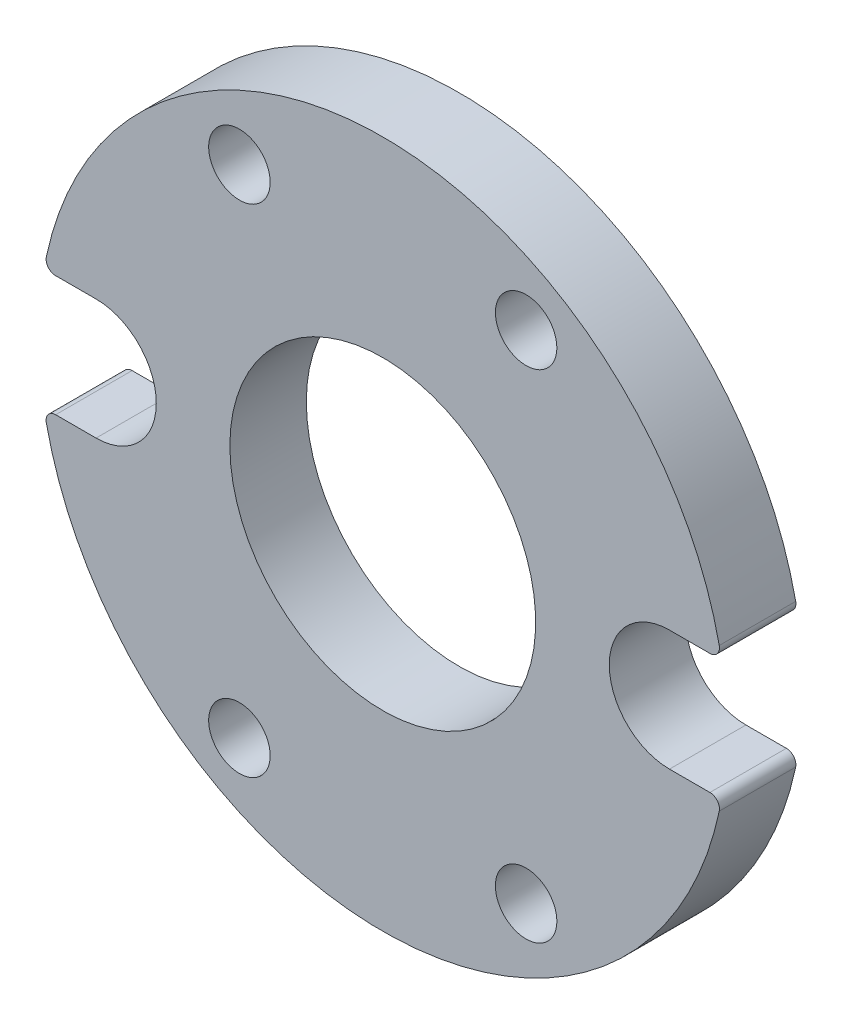
ISO-10303-21;
HEADER;
FILE_DESCRIPTION(('STEP AP214'),'2;1');
FILE_NAME('part.step','',(''),(''),'','','');
FILE_SCHEMA(('AUTOMOTIVE_DESIGN { 1 0 10303 214 1 1 1 1 }'));
ENDSEC;
DATA;
#1=APPLICATION_CONTEXT('core data for automotive mechanical design processes');
#2=APPLICATION_PROTOCOL_DEFINITION('international standard','automotive_design',2000,#1);
#3=PRODUCT_CONTEXT('',#1,'mechanical');
#4=PRODUCT('Part','Part','',(#3));
#5=PRODUCT_RELATED_PRODUCT_CATEGORY('part','',(#4));
#6=PRODUCT_DEFINITION_FORMATION('','',#4);
#7=PRODUCT_DEFINITION_CONTEXT('part definition',#1,'design');
#8=PRODUCT_DEFINITION('design','',#6,#7);
#9=PRODUCT_DEFINITION_SHAPE('','',#8);
#10=(LENGTH_UNIT() NAMED_UNIT(*) SI_UNIT(.MILLI.,.METRE.));
#11=(NAMED_UNIT(*) PLANE_ANGLE_UNIT() SI_UNIT($,.RADIAN.));
#12=(NAMED_UNIT(*) SI_UNIT($,.STERADIAN.) SOLID_ANGLE_UNIT());
#13=UNCERTAINTY_MEASURE_WITH_UNIT(LENGTH_MEASURE(1.E-05),#10,'distance_accuracy_value','');
#14=(GEOMETRIC_REPRESENTATION_CONTEXT(3) GLOBAL_UNCERTAINTY_ASSIGNED_CONTEXT((#13)) GLOBAL_UNIT_ASSIGNED_CONTEXT((#10,
#11,#12)) REPRESENTATION_CONTEXT('',''));
#15=CARTESIAN_POINT('',(0.,0.,0.));
#16=DIRECTION('',(0.,0.,1.));
#17=DIRECTION('',(1.,0.,0.));
#18=AXIS2_PLACEMENT_3D('',#15,#16,#17);
#19=CARTESIAN_POINT('',(27.1703940438853,5.79375,3.175));
#20=DIRECTION('',(0.,0.,-1.));
#21=DIRECTION('',(-1.,0.,0.));
#22=AXIS2_PLACEMENT_3D('',#19,#20,#21);
#23=CYLINDRICAL_SURFACE('',#22,0.793749999999999);
#24=CARTESIAN_POINT('',(27.1703940438853,5.79375,3.175));
#25=DIRECTION('',(0.,0.,-1.));
#26=DIRECTION('',(-1.,0.,0.));
#27=AXIS2_PLACEMENT_3D('',#24,#25,#26);
#28=CIRCLE('',#27,0.793749999999999);
#29=CARTESIAN_POINT('',(27.1703940438853,5.,3.175));
#30=VERTEX_POINT('',#29);
#31=CARTESIAN_POINT('',(27.9466910165678,5.95928571428572,3.175));
#32=VERTEX_POINT('',#31);
#33=EDGE_CURVE('E95',#30,#32,#28,.F.);
#34=ORIENTED_EDGE('',*,*,#33,.F.);
#35=DIRECTION('',(0.,0.,-1.));
#36=VECTOR('',#35,1.);
#37=CARTESIAN_POINT('',(27.1703940438853,5.,-3.175));
#38=LINE('',#37,#36);
#39=CARTESIAN_POINT('',(27.1703940438853,5.,-3.175));
#40=VERTEX_POINT('',#39);
#41=EDGE_CURVE('E149',#40,#30,#38,.F.);
#42=ORIENTED_EDGE('',*,*,#41,.F.);
#43=CARTESIAN_POINT('',(27.1703940438853,5.79375,-3.175));
#44=DIRECTION('',(0.,0.,-1.));
#45=DIRECTION('',(-1.,0.,0.));
#46=AXIS2_PLACEMENT_3D('',#43,#44,#45);
#47=CIRCLE('',#46,0.793749999999999);
#48=CARTESIAN_POINT('',(27.9466910165678,5.95928571428572,-3.175));
#49=VERTEX_POINT('',#48);
#50=EDGE_CURVE('E19',#40,#49,#47,.F.);
#51=ORIENTED_EDGE('',*,*,#50,.T.);
#52=DIRECTION('',(0.,0.,-1.));
#53=VECTOR('',#52,1.);
#54=CARTESIAN_POINT('',(27.9466910165678,5.95928571428572,3.175));
#55=LINE('',#54,#53);
#56=EDGE_CURVE('E107',#32,#49,#55,.T.);
#57=ORIENTED_EDGE('',*,*,#56,.F.);
#58=EDGE_LOOP('',(#34,#42,#51,#57));
#59=FACE_BOUND('',#58,.T.);
#60=ADVANCED_FACE('F16',(#59),#23,.T.);
#61=CARTESIAN_POINT('',(-27.1703940438853,5.79375,3.175));
#62=DIRECTION('',(0.,0.,-1.));
#63=DIRECTION('',(-1.,0.,0.));
#64=AXIS2_PLACEMENT_3D('',#61,#62,#63);
#65=CYLINDRICAL_SURFACE('',#64,0.793749999999999);
#66=CARTESIAN_POINT('',(-27.1703940438853,5.79375,-3.175));
#67=DIRECTION('',(0.,0.,-1.));
#68=DIRECTION('',(-1.,0.,0.));
#69=AXIS2_PLACEMENT_3D('',#66,#67,#68);
#70=CIRCLE('',#69,0.793749999999999);
#71=CARTESIAN_POINT('',(-27.9466910165678,5.95928571428572,-3.175));
#72=VERTEX_POINT('',#71);
#73=CARTESIAN_POINT('',(-27.1703940438853,5.,-3.175));
#74=VERTEX_POINT('',#73);
#75=EDGE_CURVE('E83',#72,#74,#70,.F.);
#76=ORIENTED_EDGE('',*,*,#75,.T.);
#77=DIRECTION('',(0.,0.,1.));
#78=VECTOR('',#77,1.);
#79=CARTESIAN_POINT('',(-27.1703940438853,5.,-3.175));
#80=LINE('',#79,#78);
#81=CARTESIAN_POINT('',(-27.1703940438853,5.,3.175));
#82=VERTEX_POINT('',#81);
#83=EDGE_CURVE('E185',#74,#82,#80,.T.);
#84=ORIENTED_EDGE('',*,*,#83,.T.);
#85=CARTESIAN_POINT('',(-27.1703940438853,5.79375,3.175));
#86=DIRECTION('',(0.,0.,-1.));
#87=DIRECTION('',(-1.,0.,0.));
#88=AXIS2_PLACEMENT_3D('',#85,#86,#87);
#89=CIRCLE('',#88,0.793749999999999);
#90=CARTESIAN_POINT('',(-27.9466910165678,5.95928571428572,3.175));
#91=VERTEX_POINT('',#90);
#92=EDGE_CURVE('E99',#91,#82,#89,.F.);
#93=ORIENTED_EDGE('',*,*,#92,.F.);
#94=DIRECTION('',(0.,0.,-1.));
#95=VECTOR('',#94,1.);
#96=CARTESIAN_POINT('',(-27.9466910165678,5.95928571428572,3.175));
#97=LINE('',#96,#95);
#98=EDGE_CURVE('E97',#72,#91,#97,.F.);
#99=ORIENTED_EDGE('',*,*,#98,.F.);
#100=EDGE_LOOP('',(#76,#84,#93,#99));
#101=FACE_BOUND('',#100,.T.);
#102=ADVANCED_FACE('F98',(#101),#65,.T.);
#103=CARTESIAN_POINT('',(0.,0.,3.175));
#104=DIRECTION('',(0.,0.,1.));
#105=DIRECTION('',(1.,0.,0.));
#106=AXIS2_PLACEMENT_3D('',#103,#104,#105);
#107=PLANE('',#106);
#108=DIRECTION('',(-1.,0.,0.));
#109=VECTOR('',#108,1.);
#110=CARTESIAN_POINT('',(0.,4.99999999999999,3.175));
#111=LINE('',#110,#109);
#112=CARTESIAN_POINT('',(-23.8125,5.,3.175));
#113=VERTEX_POINT('',#112);
#114=EDGE_CURVE('E187',#82,#113,#111,.F.);
#115=ORIENTED_EDGE('',*,*,#114,.T.);
#116=CARTESIAN_POINT('',(-23.8125,0.,3.175));
#117=DIRECTION('',(0.,0.,1.));
#118=DIRECTION('',(1.,0.,0.));
#119=AXIS2_PLACEMENT_3D('',#116,#117,#118);
#120=CIRCLE('',#119,5.);
#121=CARTESIAN_POINT('',(-23.8125,-5.,3.175));
#122=VERTEX_POINT('',#121);
#123=EDGE_CURVE('E140',#113,#122,#120,.F.);
#124=ORIENTED_EDGE('',*,*,#123,.T.);
#125=DIRECTION('',(-1.,0.,0.));
#126=VECTOR('',#125,1.);
#127=CARTESIAN_POINT('',(0.,-4.99999999999999,3.175));
#128=LINE('',#127,#126);
#129=CARTESIAN_POINT('',(-27.1703940438853,-5.,3.175));
#130=VERTEX_POINT('',#129);
#131=EDGE_CURVE('E199',#130,#122,#128,.F.);
#132=ORIENTED_EDGE('',*,*,#131,.F.);
#133=CARTESIAN_POINT('',(-27.1703940438853,-5.79375,3.175));
#134=DIRECTION('',(0.,0.,-1.));
#135=DIRECTION('',(-1.,0.,0.));
#136=AXIS2_PLACEMENT_3D('',#133,#134,#135);
#137=CIRCLE('',#136,0.793749999999999);
#138=CARTESIAN_POINT('',(-27.9466910165678,-5.95928571428571,3.175));
#139=VERTEX_POINT('',#138);
#140=EDGE_CURVE('E174',#139,#130,#137,.T.);
#141=ORIENTED_EDGE('',*,*,#140,.F.);
#142=CARTESIAN_POINT('',(0.,0.,3.175));
#143=DIRECTION('',(0.,0.,-1.));
#144=DIRECTION('',(-1.,0.,0.));
#145=AXIS2_PLACEMENT_3D('',#142,#143,#144);
#146=CIRCLE('',#145,28.575);
#147=CARTESIAN_POINT('',(27.9466910165678,-5.95928571428571,3.175));
#148=VERTEX_POINT('',#147);
#149=EDGE_CURVE('E136',#148,#139,#146,.T.);
#150=ORIENTED_EDGE('',*,*,#149,.F.);
#151=CARTESIAN_POINT('',(27.1703940438853,-5.79375,3.175));
#152=DIRECTION('',(0.,0.,-1.));
#153=DIRECTION('',(-1.,0.,0.));
#154=AXIS2_PLACEMENT_3D('',#151,#152,#153);
#155=CIRCLE('',#154,0.793749999999999);
#156=CARTESIAN_POINT('',(27.1703940438853,-5.,3.175));
#157=VERTEX_POINT('',#156);
#158=EDGE_CURVE('E167',#157,#148,#155,.T.);
#159=ORIENTED_EDGE('',*,*,#158,.F.);
#160=DIRECTION('',(1.,0.,0.));
#161=VECTOR('',#160,1.);
#162=CARTESIAN_POINT('',(0.,-5.,3.175));
#163=LINE('',#162,#161);
#164=CARTESIAN_POINT('',(23.8125,-5.,3.175));
#165=VERTEX_POINT('',#164);
#166=EDGE_CURVE('E196',#157,#165,#163,.F.);
#167=ORIENTED_EDGE('',*,*,#166,.T.);
#168=CARTESIAN_POINT('',(23.8125,0.,3.175));
#169=DIRECTION('',(0.,0.,1.));
#170=DIRECTION('',(1.,0.,0.));
#171=AXIS2_PLACEMENT_3D('',#168,#169,#170);
#172=CIRCLE('',#171,5.);
#173=CARTESIAN_POINT('',(23.8125,5.,3.175));
#174=VERTEX_POINT('',#173);
#175=EDGE_CURVE('E146',#165,#174,#172,.F.);
#176=ORIENTED_EDGE('',*,*,#175,.T.);
#177=DIRECTION('',(1.,0.,0.));
#178=VECTOR('',#177,1.);
#179=CARTESIAN_POINT('',(0.,5.,3.175));
#180=LINE('',#179,#178);
#181=EDGE_CURVE('E184',#30,#174,#180,.F.);
#182=ORIENTED_EDGE('',*,*,#181,.F.);
#183=ORIENTED_EDGE('',*,*,#33,.T.);
#184=CARTESIAN_POINT('',(0.,0.,3.175));
#185=DIRECTION('',(0.,0.,-1.));
#186=DIRECTION('',(-1.,0.,0.));
#187=AXIS2_PLACEMENT_3D('',#184,#185,#186);
#188=CIRCLE('',#187,28.575);
#189=EDGE_CURVE('E103',#91,#32,#188,.T.);
#190=ORIENTED_EDGE('',*,*,#189,.F.);
#191=ORIENTED_EDGE('',*,*,#92,.T.);
#192=EDGE_LOOP('',(#115,#124,#132,#141,#150,#159,#167,#176,#182,#183,#190,#191));
#193=FACE_BOUND('',#192,.T.);
#194=CARTESIAN_POINT('',(0.,0.,3.175));
#195=DIRECTION('',(0.,0.,-1.));
#196=DIRECTION('',(-1.,0.,0.));
#197=AXIS2_PLACEMENT_3D('',#194,#195,#196);
#198=CIRCLE('',#197,12.7);
#199=CARTESIAN_POINT('',(-12.7,0.,3.175));
#200=VERTEX_POINT('',#199);
#201=EDGE_CURVE('E151',#200,#200,#198,.T.);
#202=ORIENTED_EDGE('',*,*,#201,.T.);
#203=EDGE_LOOP('',(#202));
#204=FACE_BOUND('',#203,.T.);
#205=CARTESIAN_POINT('',(11.90625,20.622229927617,3.175));
#206=DIRECTION('',(0.,0.,1.));
#207=DIRECTION('',(1.,0.,0.));
#208=AXIS2_PLACEMENT_3D('',#205,#206,#207);
#209=CIRCLE('',#208,2.5527);
#210=CARTESIAN_POINT('',(14.45895,20.622229927617,3.175));
#211=VERTEX_POINT('',#210);
#212=EDGE_CURVE('E155',#211,#211,#209,.F.);
#213=ORIENTED_EDGE('',*,*,#212,.T.);
#214=EDGE_LOOP('',(#213));
#215=FACE_BOUND('',#214,.T.);
#216=CARTESIAN_POINT('',(-11.9062500000001,20.6222299276169,3.175));
#217=DIRECTION('',(0.,0.,1.));
#218=DIRECTION('',(1.,0.,0.));
#219=AXIS2_PLACEMENT_3D('',#216,#217,#218);
#220=CIRCLE('',#219,2.5527);
#221=CARTESIAN_POINT('',(-9.3535500000001,20.6222299276169,3.175));
#222=VERTEX_POINT('',#221);
#223=EDGE_CURVE('E158',#222,#222,#220,.F.);
#224=ORIENTED_EDGE('',*,*,#223,.T.);
#225=EDGE_LOOP('',(#224));
#226=FACE_BOUND('',#225,.T.);
#227=CARTESIAN_POINT('',(-11.9062499999998,-20.6222299276171,3.175));
#228=DIRECTION('',(0.,0.,1.));
#229=DIRECTION('',(1.,0.,0.));
#230=AXIS2_PLACEMENT_3D('',#227,#228,#229);
#231=CIRCLE('',#230,2.5527);
#232=CARTESIAN_POINT('',(-9.35354999999981,-20.6222299276171,3.175));
#233=VERTEX_POINT('',#232);
#234=EDGE_CURVE('E161',#233,#233,#231,.F.);
#235=ORIENTED_EDGE('',*,*,#234,.T.);
#236=EDGE_LOOP('',(#235));
#237=FACE_BOUND('',#236,.T.);
#238=CARTESIAN_POINT('',(11.9062500000002,-20.6222299276168,3.175));
#239=DIRECTION('',(0.,0.,1.));
#240=DIRECTION('',(1.,0.,0.));
#241=AXIS2_PLACEMENT_3D('',#238,#239,#240);
#242=CIRCLE('',#241,2.5527);
#243=CARTESIAN_POINT('',(14.4589500000002,-20.6222299276168,3.175));
#244=VERTEX_POINT('',#243);
#245=EDGE_CURVE('E164',#244,#244,#242,.F.);
#246=ORIENTED_EDGE('',*,*,#245,.T.);
#247=EDGE_LOOP('',(#246));
#248=FACE_BOUND('',#247,.T.);
#249=ADVANCED_FACE('F181',(#193,#204,#215,#226,#237,#248),#107,.T.);
#250=CARTESIAN_POINT('',(-27.1703940438853,-5.79375,3.175));
#251=DIRECTION('',(0.,0.,-1.));
#252=DIRECTION('',(-1.,0.,0.));
#253=AXIS2_PLACEMENT_3D('',#250,#251,#252);
#254=CYLINDRICAL_SURFACE('',#253,0.793749999999999);
#255=CARTESIAN_POINT('',(-27.1703940438853,-5.79375,-3.175));
#256=DIRECTION('',(0.,0.,-1.));
#257=DIRECTION('',(-1.,0.,0.));
#258=AXIS2_PLACEMENT_3D('',#255,#256,#257);
#259=CIRCLE('',#258,0.793749999999999);
#260=CARTESIAN_POINT('',(-27.1703940438853,-5.,-3.175));
#261=VERTEX_POINT('',#260);
#262=CARTESIAN_POINT('',(-27.9466910165678,-5.95928571428571,-3.175));
#263=VERTEX_POINT('',#262);
#264=EDGE_CURVE('E34',#261,#263,#259,.F.);
#265=ORIENTED_EDGE('',*,*,#264,.T.);
#266=DIRECTION('',(0.,0.,-1.));
#267=VECTOR('',#266,1.);
#268=CARTESIAN_POINT('',(-27.9466910165678,-5.95928571428571,3.175));
#269=LINE('',#268,#267);
#270=EDGE_CURVE('E138',#139,#263,#269,.T.);
#271=ORIENTED_EDGE('',*,*,#270,.F.);
#272=ORIENTED_EDGE('',*,*,#140,.T.);
#273=DIRECTION('',(0.,0.,1.));
#274=VECTOR('',#273,1.);
#275=CARTESIAN_POINT('',(-27.1703940438853,-5.,-3.175));
#276=LINE('',#275,#274);
#277=EDGE_CURVE('E143',#261,#130,#276,.T.);
#278=ORIENTED_EDGE('',*,*,#277,.F.);
#279=EDGE_LOOP('',(#265,#271,#272,#278));
#280=FACE_BOUND('',#279,.T.);
#281=ADVANCED_FACE('F262',(#280),#254,.T.);
#282=CARTESIAN_POINT('',(27.1703940438853,-5.79375,3.175));
#283=DIRECTION('',(0.,0.,-1.));
#284=DIRECTION('',(-1.,0.,0.));
#285=AXIS2_PLACEMENT_3D('',#282,#283,#284);
#286=CYLINDRICAL_SURFACE('',#285,0.793749999999999);
#287=ORIENTED_EDGE('',*,*,#158,.T.);
#288=DIRECTION('',(0.,0.,-1.));
#289=VECTOR('',#288,1.);
#290=CARTESIAN_POINT('',(27.9466910165678,-5.95928571428571,3.175));
#291=LINE('',#290,#289);
#292=CARTESIAN_POINT('',(27.9466910165678,-5.95928571428571,-3.175));
#293=VERTEX_POINT('',#292);
#294=EDGE_CURVE('E135',#293,#148,#291,.F.);
#295=ORIENTED_EDGE('',*,*,#294,.F.);
#296=CARTESIAN_POINT('',(27.1703940438853,-5.79375,-3.175));
#297=DIRECTION('',(0.,0.,-1.));
#298=DIRECTION('',(-1.,0.,0.));
#299=AXIS2_PLACEMENT_3D('',#296,#297,#298);
#300=CIRCLE('',#299,0.793749999999999);
#301=CARTESIAN_POINT('',(27.1703940438853,-5.,-3.175));
#302=VERTEX_POINT('',#301);
#303=EDGE_CURVE('E170',#293,#302,#300,.F.);
#304=ORIENTED_EDGE('',*,*,#303,.T.);
#305=DIRECTION('',(0.,0.,-1.));
#306=VECTOR('',#305,1.);
#307=CARTESIAN_POINT('',(27.1703940438853,-5.,-3.175));
#308=LINE('',#307,#306);
#309=EDGE_CURVE('E154',#302,#157,#308,.F.);
#310=ORIENTED_EDGE('',*,*,#309,.T.);
#311=EDGE_LOOP('',(#287,#295,#304,#310));
#312=FACE_BOUND('',#311,.T.);
#313=ADVANCED_FACE('F259',(#312),#286,.T.);
#314=CARTESIAN_POINT('',(11.9062500000002,-20.6222299276168,-3.175));
#315=DIRECTION('',(0.,0.,1.));
#316=DIRECTION('',(1.,0.,0.));
#317=AXIS2_PLACEMENT_3D('',#314,#315,#316);
#318=CYLINDRICAL_SURFACE('',#317,2.5527);
#319=CARTESIAN_POINT('',(11.9062500000002,-20.6222299276168,-3.175));
#320=DIRECTION('',(0.,0.,1.));
#321=DIRECTION('',(1.,0.,0.));
#322=AXIS2_PLACEMENT_3D('',#319,#320,#321);
#323=CIRCLE('',#322,2.5527);
#324=CARTESIAN_POINT('',(14.4589500000002,-20.6222299276168,-3.175));
#325=VERTEX_POINT('',#324);
#326=EDGE_CURVE('E132',#325,#325,#323,.F.);
#327=ORIENTED_EDGE('',*,*,#326,.T.);
#328=EDGE_LOOP('',(#327));
#329=FACE_BOUND('',#328,.T.);
#330=ORIENTED_EDGE('',*,*,#245,.F.);
#331=EDGE_LOOP('',(#330));
#332=FACE_BOUND('',#331,.T.);
#333=ADVANCED_FACE('F271',(#329,#332),#318,.F.);
#334=CARTESIAN_POINT('',(-11.9062499999998,-20.6222299276171,-3.175));
#335=DIRECTION('',(0.,0.,1.));
#336=DIRECTION('',(1.,0.,0.));
#337=AXIS2_PLACEMENT_3D('',#334,#335,#336);
#338=CYLINDRICAL_SURFACE('',#337,2.5527);
#339=CARTESIAN_POINT('',(-11.9062499999998,-20.6222299276171,-3.175));
#340=DIRECTION('',(0.,0.,1.));
#341=DIRECTION('',(1.,0.,0.));
#342=AXIS2_PLACEMENT_3D('',#339,#340,#341);
#343=CIRCLE('',#342,2.5527);
#344=CARTESIAN_POINT('',(-9.35354999999981,-20.6222299276171,-3.175));
#345=VERTEX_POINT('',#344);
#346=EDGE_CURVE('E129',#345,#345,#343,.F.);
#347=ORIENTED_EDGE('',*,*,#346,.T.);
#348=EDGE_LOOP('',(#347));
#349=FACE_BOUND('',#348,.T.);
#350=ORIENTED_EDGE('',*,*,#234,.F.);
#351=EDGE_LOOP('',(#350));
#352=FACE_BOUND('',#351,.T.);
#353=ADVANCED_FACE('F308',(#349,#352),#338,.F.);
#354=CARTESIAN_POINT('',(-11.9062500000001,20.6222299276169,-3.175));
#355=DIRECTION('',(0.,0.,1.));
#356=DIRECTION('',(1.,0.,0.));
#357=AXIS2_PLACEMENT_3D('',#354,#355,#356);
#358=CYLINDRICAL_SURFACE('',#357,2.5527);
#359=CARTESIAN_POINT('',(-11.9062500000001,20.6222299276169,-3.175));
#360=DIRECTION('',(0.,0.,1.));
#361=DIRECTION('',(1.,0.,0.));
#362=AXIS2_PLACEMENT_3D('',#359,#360,#361);
#363=CIRCLE('',#362,2.5527);
#364=CARTESIAN_POINT('',(-9.3535500000001,20.6222299276169,-3.175));
#365=VERTEX_POINT('',#364);
#366=EDGE_CURVE('E126',#365,#365,#363,.F.);
#367=ORIENTED_EDGE('',*,*,#366,.T.);
#368=EDGE_LOOP('',(#367));
#369=FACE_BOUND('',#368,.T.);
#370=ORIENTED_EDGE('',*,*,#223,.F.);
#371=EDGE_LOOP('',(#370));
#372=FACE_BOUND('',#371,.T.);
#373=ADVANCED_FACE('F304',(#369,#372),#358,.F.);
#374=CARTESIAN_POINT('',(11.90625,20.622229927617,-3.175));
#375=DIRECTION('',(0.,0.,1.));
#376=DIRECTION('',(1.,0.,0.));
#377=AXIS2_PLACEMENT_3D('',#374,#375,#376);
#378=CYLINDRICAL_SURFACE('',#377,2.5527);
#379=CARTESIAN_POINT('',(11.90625,20.622229927617,-3.175));
#380=DIRECTION('',(0.,0.,1.));
#381=DIRECTION('',(1.,0.,0.));
#382=AXIS2_PLACEMENT_3D('',#379,#380,#381);
#383=CIRCLE('',#382,2.5527);
#384=CARTESIAN_POINT('',(14.45895,20.622229927617,-3.175));
#385=VERTEX_POINT('',#384);
#386=EDGE_CURVE('E123',#385,#385,#383,.F.);
#387=ORIENTED_EDGE('',*,*,#386,.T.);
#388=EDGE_LOOP('',(#387));
#389=FACE_BOUND('',#388,.T.);
#390=ORIENTED_EDGE('',*,*,#212,.F.);
#391=EDGE_LOOP('',(#390));
#392=FACE_BOUND('',#391,.T.);
#393=ADVANCED_FACE('F300',(#389,#392),#378,.F.);
#394=CARTESIAN_POINT('',(0.,0.,3.175));
#395=DIRECTION('',(0.,0.,-1.));
#396=DIRECTION('',(-1.,0.,0.));
#397=AXIS2_PLACEMENT_3D('',#394,#395,#396);
#398=CYLINDRICAL_SURFACE('',#397,12.7);
#399=CARTESIAN_POINT('',(0.,0.,-3.175));
#400=DIRECTION('',(0.,0.,-1.));
#401=DIRECTION('',(-1.,0.,0.));
#402=AXIS2_PLACEMENT_3D('',#399,#400,#401);
#403=CIRCLE('',#402,12.7);
#404=CARTESIAN_POINT('',(-12.7,0.,-3.175));
#405=VERTEX_POINT('',#404);
#406=EDGE_CURVE('E120',#405,#405,#403,.T.);
#407=ORIENTED_EDGE('',*,*,#406,.T.);
#408=EDGE_LOOP('',(#407));
#409=FACE_BOUND('',#408,.T.);
#410=ORIENTED_EDGE('',*,*,#201,.F.);
#411=EDGE_LOOP('',(#410));
#412=FACE_BOUND('',#411,.T.);
#413=ADVANCED_FACE('F297',(#409,#412),#398,.F.);
#414=CARTESIAN_POINT('',(0.,-5.,-3.175));
#415=DIRECTION('',(0.,-1.,0.));
#416=DIRECTION('',(0.,0.,-1.));
#417=AXIS2_PLACEMENT_3D('',#414,#415,#416);
#418=PLANE('',#417);
#419=ORIENTED_EDGE('',*,*,#309,.F.);
#420=DIRECTION('',(1.,0.,0.));
#421=VECTOR('',#420,1.);
#422=CARTESIAN_POINT('',(0.,-5.,-3.175));
#423=LINE('',#422,#421);
#424=CARTESIAN_POINT('',(23.8125,-5.,-3.175));
#425=VERTEX_POINT('',#424);
#426=EDGE_CURVE('E119',#302,#425,#423,.F.);
#427=ORIENTED_EDGE('',*,*,#426,.T.);
#428=DIRECTION('',(0.,0.,1.));
#429=VECTOR('',#428,1.);
#430=CARTESIAN_POINT('',(23.8125,-5.,-3.175));
#431=LINE('',#430,#429);
#432=EDGE_CURVE('E150',#425,#165,#431,.T.);
#433=ORIENTED_EDGE('',*,*,#432,.T.);
#434=ORIENTED_EDGE('',*,*,#166,.F.);
#435=EDGE_LOOP('',(#419,#427,#433,#434));
#436=FACE_BOUND('',#435,.T.);
#437=ADVANCED_FACE('F220',(#436),#418,.F.);
#438=CARTESIAN_POINT('',(23.8125,0.,-3.175));
#439=DIRECTION('',(0.,0.,1.));
#440=DIRECTION('',(1.,0.,0.));
#441=AXIS2_PLACEMENT_3D('',#438,#439,#440);
#442=CYLINDRICAL_SURFACE('',#441,5.);
#443=ORIENTED_EDGE('',*,*,#432,.F.);
#444=CARTESIAN_POINT('',(23.8125,0.,-3.175));
#445=DIRECTION('',(0.,0.,1.));
#446=DIRECTION('',(1.,0.,0.));
#447=AXIS2_PLACEMENT_3D('',#444,#445,#446);
#448=CIRCLE('',#447,5.);
#449=CARTESIAN_POINT('',(23.8125,5.,-3.175));
#450=VERTEX_POINT('',#449);
#451=EDGE_CURVE('E113',#425,#450,#448,.F.);
#452=ORIENTED_EDGE('',*,*,#451,.T.);
#453=DIRECTION('',(0.,0.,-1.));
#454=VECTOR('',#453,1.);
#455=CARTESIAN_POINT('',(23.8125,5.,-3.175));
#456=LINE('',#455,#454);
#457=EDGE_CURVE('E104',#174,#450,#456,.T.);
#458=ORIENTED_EDGE('',*,*,#457,.F.);
#459=ORIENTED_EDGE('',*,*,#175,.F.);
#460=EDGE_LOOP('',(#443,#452,#458,#459));
#461=FACE_BOUND('',#460,.T.);
#462=ADVANCED_FACE('F216',(#461),#442,.F.);
#463=CARTESIAN_POINT('',(0.,5.,-3.175));
#464=DIRECTION('',(0.,-1.,0.));
#465=DIRECTION('',(0.,0.,-1.));
#466=AXIS2_PLACEMENT_3D('',#463,#464,#465);
#467=PLANE('',#466);
#468=ORIENTED_EDGE('',*,*,#181,.T.);
#469=ORIENTED_EDGE('',*,*,#457,.T.);
#470=DIRECTION('',(1.,0.,0.));
#471=VECTOR('',#470,1.);
#472=CARTESIAN_POINT('',(0.,5.,-3.175));
#473=LINE('',#472,#471);
#474=EDGE_CURVE('E108',#450,#40,#473,.T.);
#475=ORIENTED_EDGE('',*,*,#474,.T.);
#476=ORIENTED_EDGE('',*,*,#41,.T.);
#477=EDGE_LOOP('',(#468,#469,#475,#476));
#478=FACE_BOUND('',#477,.T.);
#479=ADVANCED_FACE('F289',(#478),#467,.T.);
#480=CARTESIAN_POINT('',(0.,0.,3.175));
#481=DIRECTION('',(0.,0.,-1.));
#482=DIRECTION('',(-1.,0.,0.));
#483=AXIS2_PLACEMENT_3D('',#480,#481,#482);
#484=CYLINDRICAL_SURFACE('',#483,28.575);
#485=ORIENTED_EDGE('',*,*,#189,.T.);
#486=ORIENTED_EDGE('',*,*,#56,.T.);
#487=CARTESIAN_POINT('',(0.,0.,-3.175));
#488=DIRECTION('',(0.,0.,-1.));
#489=DIRECTION('',(-1.,0.,0.));
#490=AXIS2_PLACEMENT_3D('',#487,#488,#489);
#491=CIRCLE('',#490,28.575);
#492=EDGE_CURVE('E88',#49,#72,#491,.F.);
#493=ORIENTED_EDGE('',*,*,#492,.T.);
#494=ORIENTED_EDGE('',*,*,#98,.T.);
#495=EDGE_LOOP('',(#485,#486,#493,#494));
#496=FACE_BOUND('',#495,.T.);
#497=ADVANCED_FACE('F106',(#496),#484,.T.);
#498=CARTESIAN_POINT('',(0.,4.99999999999999,-3.175));
#499=DIRECTION('',(0.,1.,0.));
#500=DIRECTION('',(-1.,0.,0.));
#501=AXIS2_PLACEMENT_3D('',#498,#499,#500);
#502=PLANE('',#501);
#503=ORIENTED_EDGE('',*,*,#83,.F.);
#504=DIRECTION('',(1.,0.,0.));
#505=VECTOR('',#504,1.);
#506=CARTESIAN_POINT('',(0.,5.,-3.175));
#507=LINE('',#506,#505);
#508=CARTESIAN_POINT('',(-23.8125,5.,-3.175));
#509=VERTEX_POINT('',#508);
#510=EDGE_CURVE('E91',#74,#509,#507,.T.);
#511=ORIENTED_EDGE('',*,*,#510,.T.);
#512=DIRECTION('',(0.,0.,1.));
#513=VECTOR('',#512,1.);
#514=CARTESIAN_POINT('',(-23.8125,5.,-3.175));
#515=LINE('',#514,#513);
#516=EDGE_CURVE('E144',#509,#113,#515,.T.);
#517=ORIENTED_EDGE('',*,*,#516,.T.);
#518=ORIENTED_EDGE('',*,*,#114,.F.);
#519=EDGE_LOOP('',(#503,#511,#517,#518));
#520=FACE_BOUND('',#519,.T.);
#521=ADVANCED_FACE('F236',(#520),#502,.F.);
#522=CARTESIAN_POINT('',(-23.8125,0.,-3.175));
#523=DIRECTION('',(0.,0.,1.));
#524=DIRECTION('',(1.,0.,0.));
#525=AXIS2_PLACEMENT_3D('',#522,#523,#524);
#526=CYLINDRICAL_SURFACE('',#525,5.);
#527=CARTESIAN_POINT('',(-23.8125,0.,-3.175));
#528=DIRECTION('',(0.,0.,1.));
#529=DIRECTION('',(1.,0.,0.));
#530=AXIS2_PLACEMENT_3D('',#527,#528,#529);
#531=CIRCLE('',#530,5.);
#532=CARTESIAN_POINT('',(-23.8125,-5.,-3.175));
#533=VERTEX_POINT('',#532);
#534=EDGE_CURVE('E110',#509,#533,#531,.F.);
#535=ORIENTED_EDGE('',*,*,#534,.T.);
#536=DIRECTION('',(0.,0.,1.));
#537=VECTOR('',#536,1.);
#538=CARTESIAN_POINT('',(-23.8125,-5.,-3.175));
#539=LINE('',#538,#537);
#540=EDGE_CURVE('E139',#122,#533,#539,.F.);
#541=ORIENTED_EDGE('',*,*,#540,.F.);
#542=ORIENTED_EDGE('',*,*,#123,.F.);
#543=ORIENTED_EDGE('',*,*,#516,.F.);
#544=EDGE_LOOP('',(#535,#541,#542,#543));
#545=FACE_BOUND('',#544,.T.);
#546=ADVANCED_FACE('F241',(#545),#526,.F.);
#547=CARTESIAN_POINT('',(0.,-4.99999999999999,-3.175));
#548=DIRECTION('',(0.,1.,0.));
#549=DIRECTION('',(-1.,0.,0.));
#550=AXIS2_PLACEMENT_3D('',#547,#548,#549);
#551=PLANE('',#550);
#552=ORIENTED_EDGE('',*,*,#131,.T.);
#553=ORIENTED_EDGE('',*,*,#540,.T.);
#554=DIRECTION('',(1.,0.,0.));
#555=VECTOR('',#554,1.);
#556=CARTESIAN_POINT('',(0.,-5.,-3.175));
#557=LINE('',#556,#555);
#558=EDGE_CURVE('E25',#533,#261,#557,.F.);
#559=ORIENTED_EDGE('',*,*,#558,.T.);
#560=ORIENTED_EDGE('',*,*,#277,.T.);
#561=EDGE_LOOP('',(#552,#553,#559,#560));
#562=FACE_BOUND('',#561,.T.);
#563=ADVANCED_FACE('F248',(#562),#551,.T.);
#564=CARTESIAN_POINT('',(0.,0.,3.175));
#565=DIRECTION('',(0.,0.,-1.));
#566=DIRECTION('',(-1.,0.,0.));
#567=AXIS2_PLACEMENT_3D('',#564,#565,#566);
#568=CYLINDRICAL_SURFACE('',#567,28.575);
#569=CARTESIAN_POINT('',(0.,0.,-3.175));
#570=DIRECTION('',(0.,0.,-1.));
#571=DIRECTION('',(-1.,0.,0.));
#572=AXIS2_PLACEMENT_3D('',#569,#570,#571);
#573=CIRCLE('',#572,28.575);
#574=EDGE_CURVE('E11',#263,#293,#573,.F.);
#575=ORIENTED_EDGE('',*,*,#574,.T.);
#576=ORIENTED_EDGE('',*,*,#294,.T.);
#577=ORIENTED_EDGE('',*,*,#149,.T.);
#578=ORIENTED_EDGE('',*,*,#270,.T.);
#579=EDGE_LOOP('',(#575,#576,#577,#578));
#580=FACE_BOUND('',#579,.T.);
#581=ADVANCED_FACE('F261',(#580),#568,.T.);
#582=CARTESIAN_POINT('',(0.,0.,-3.175));
#583=DIRECTION('',(0.,0.,1.));
#584=DIRECTION('',(1.,0.,0.));
#585=AXIS2_PLACEMENT_3D('',#582,#583,#584);
#586=PLANE('',#585);
#587=ORIENTED_EDGE('',*,*,#264,.F.);
#588=ORIENTED_EDGE('',*,*,#558,.F.);
#589=ORIENTED_EDGE('',*,*,#534,.F.);
#590=ORIENTED_EDGE('',*,*,#510,.F.);
#591=ORIENTED_EDGE('',*,*,#75,.F.);
#592=ORIENTED_EDGE('',*,*,#492,.F.);
#593=ORIENTED_EDGE('',*,*,#50,.F.);
#594=ORIENTED_EDGE('',*,*,#474,.F.);
#595=ORIENTED_EDGE('',*,*,#451,.F.);
#596=ORIENTED_EDGE('',*,*,#426,.F.);
#597=ORIENTED_EDGE('',*,*,#303,.F.);
#598=ORIENTED_EDGE('',*,*,#574,.F.);
#599=EDGE_LOOP('',(#587,#588,#589,#590,#591,#592,#593,#594,#595,#596,#597,#598));
#600=FACE_BOUND('',#599,.T.);
#601=ORIENTED_EDGE('',*,*,#406,.F.);
#602=EDGE_LOOP('',(#601));
#603=FACE_BOUND('',#602,.T.);
#604=ORIENTED_EDGE('',*,*,#386,.F.);
#605=EDGE_LOOP('',(#604));
#606=FACE_BOUND('',#605,.T.);
#607=ORIENTED_EDGE('',*,*,#366,.F.);
#608=EDGE_LOOP('',(#607));
#609=FACE_BOUND('',#608,.T.);
#610=ORIENTED_EDGE('',*,*,#346,.F.);
#611=EDGE_LOOP('',(#610));
#612=FACE_BOUND('',#611,.T.);
#613=ORIENTED_EDGE('',*,*,#326,.F.);
#614=EDGE_LOOP('',(#613));
#615=FACE_BOUND('',#614,.T.);
#616=ADVANCED_FACE('F85',(#600,#603,#606,#609,#612,#615),#586,.F.);
#617=CLOSED_SHELL('',(#60,#102,#249,#281,#313,#333,#353,#373,#393,#413,#437,#462,#479,#497,#521,
#546,#563,#581,#616));
#618=MANIFOLD_SOLID_BREP('B1',#617);
#619=ADVANCED_BREP_SHAPE_REPRESENTATION('',(#18,#618),#14);
#620=SHAPE_DEFINITION_REPRESENTATION(#9,#619);
ENDSEC;
END-ISO-10303-21;
